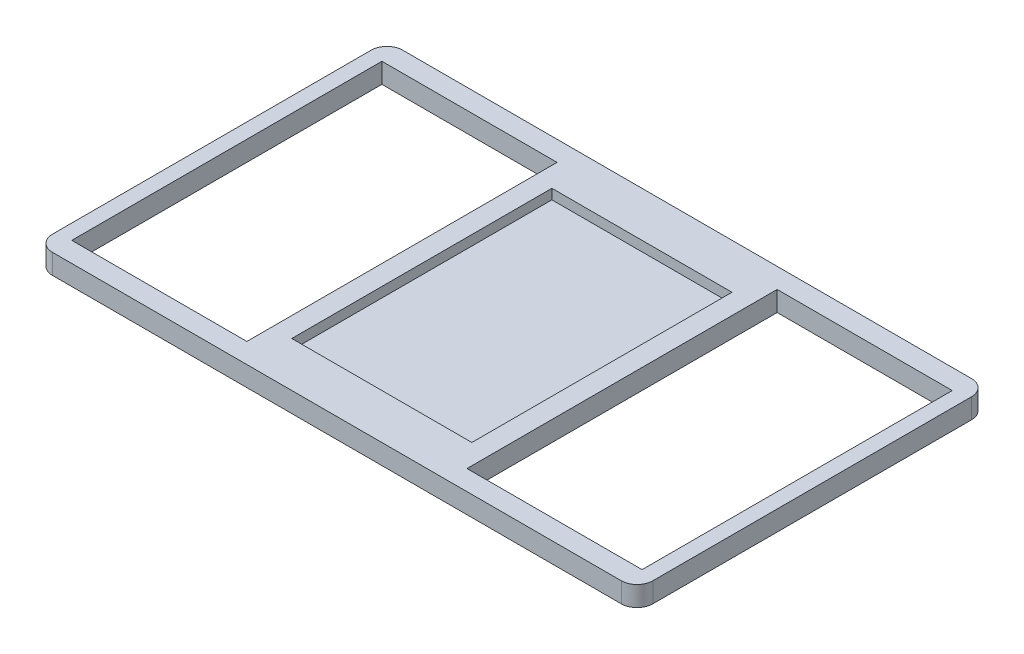
ISO-10303-21;
HEADER;
FILE_DESCRIPTION(('STEP AP214'),'2;1');
FILE_NAME('part.step','',(''),(''),'','','');
FILE_SCHEMA(('AUTOMOTIVE_DESIGN { 1 0 10303 214 1 1 1 1 }'));
ENDSEC;
DATA;
#1=APPLICATION_CONTEXT('core data for automotive mechanical design processes');
#2=APPLICATION_PROTOCOL_DEFINITION('international standard','automotive_design',2000,#1);
#3=PRODUCT_CONTEXT('',#1,'mechanical');
#4=PRODUCT('Part','Part','',(#3));
#5=PRODUCT_RELATED_PRODUCT_CATEGORY('part','',(#4));
#6=PRODUCT_DEFINITION_FORMATION('','',#4);
#7=PRODUCT_DEFINITION_CONTEXT('part definition',#1,'design');
#8=PRODUCT_DEFINITION('design','',#6,#7);
#9=PRODUCT_DEFINITION_SHAPE('','',#8);
#10=(LENGTH_UNIT() NAMED_UNIT(*) SI_UNIT(.MILLI.,.METRE.));
#11=(NAMED_UNIT(*) PLANE_ANGLE_UNIT() SI_UNIT($,.RADIAN.));
#12=(NAMED_UNIT(*) SI_UNIT($,.STERADIAN.) SOLID_ANGLE_UNIT());
#13=UNCERTAINTY_MEASURE_WITH_UNIT(LENGTH_MEASURE(1.E-05),#10,'distance_accuracy_value','');
#14=(GEOMETRIC_REPRESENTATION_CONTEXT(3) GLOBAL_UNCERTAINTY_ASSIGNED_CONTEXT((#13)) GLOBAL_UNIT_ASSIGNED_CONTEXT((#10,
#11,#12)) REPRESENTATION_CONTEXT('',''));
#15=CARTESIAN_POINT('',(0.,0.,0.));
#16=DIRECTION('',(0.,0.,1.));
#17=DIRECTION('',(1.,0.,0.));
#18=AXIS2_PLACEMENT_3D('',#15,#16,#17);
#19=CARTESIAN_POINT('',(4.79892037786772,12.7,0.));
#20=DIRECTION('',(1.,0.,0.));
#21=DIRECTION('',(0.,0.,-1.));
#22=AXIS2_PLACEMENT_3D('',#19,#20,#21);
#23=PLANE('',#22);
#24=DIRECTION('',(0.,0.,1.));
#25=VECTOR('',#24,1.);
#26=CARTESIAN_POINT('',(4.79892037786772,0.,0.));
#27=LINE('',#26,#25);
#28=CARTESIAN_POINT('',(4.79892037786772,0.,-212.25));
#29=VERTEX_POINT('',#28);
#30=CARTESIAN_POINT('',(4.79892037786772,0.,-10.));
#31=VERTEX_POINT('',#30);
#32=EDGE_CURVE('E275',#29,#31,#27,.T.);
#33=ORIENTED_EDGE('',*,*,#32,.T.);
#34=DIRECTION('',(0.,-1.,0.));
#35=VECTOR('',#34,1.);
#36=CARTESIAN_POINT('',(4.79892037786772,12.7,-10.));
#37=LINE('',#36,#35);
#38=CARTESIAN_POINT('',(4.79892037786772,12.7,-10.));
#39=VERTEX_POINT('',#38);
#40=EDGE_CURVE('E11',#31,#39,#37,.F.);
#41=ORIENTED_EDGE('',*,*,#40,.T.);
#42=DIRECTION('',(0.,0.,1.));
#43=VECTOR('',#42,1.);
#44=CARTESIAN_POINT('',(4.79892037786772,12.7,0.));
#45=LINE('',#44,#43);
#46=CARTESIAN_POINT('',(4.79892037786772,12.7,-212.25));
#47=VERTEX_POINT('',#46);
#48=EDGE_CURVE('E327',#47,#39,#45,.T.);
#49=ORIENTED_EDGE('',*,*,#48,.F.);
#50=DIRECTION('',(0.,-1.,0.));
#51=VECTOR('',#50,1.);
#52=CARTESIAN_POINT('',(4.79892037786772,12.7,-212.25));
#53=LINE('',#52,#51);
#54=EDGE_CURVE('E54',#47,#29,#53,.T.);
#55=ORIENTED_EDGE('',*,*,#54,.T.);
#56=EDGE_LOOP('',(#33,#41,#49,#55));
#57=FACE_BOUND('',#56,.T.);
#58=ADVANCED_FACE('F45',(#57),#23,.F.);
#59=CARTESIAN_POINT('',(4.79892037786772,12.7,0.));
#60=DIRECTION('',(0.,0.,-1.));
#61=DIRECTION('',(-1.,0.,0.));
#62=AXIS2_PLACEMENT_3D('',#59,#60,#61);
#63=PLANE('',#62);
#64=DIRECTION('',(1.,0.,0.));
#65=VECTOR('',#64,1.);
#66=CARTESIAN_POINT('',(4.79892037786772,0.,0.));
#67=LINE('',#66,#65);
#68=CARTESIAN_POINT('',(14.7989203778677,0.,0.));
#69=VERTEX_POINT('',#68);
#70=CARTESIAN_POINT('',(375.798920377868,0.,0.));
#71=VERTEX_POINT('',#70);
#72=EDGE_CURVE('E346',#69,#71,#67,.T.);
#73=ORIENTED_EDGE('',*,*,#72,.T.);
#74=DIRECTION('',(0.,-1.,0.));
#75=VECTOR('',#74,1.);
#76=CARTESIAN_POINT('',(375.798920377868,12.7,0.));
#77=LINE('',#76,#75);
#78=CARTESIAN_POINT('',(375.798920377868,12.7,0.));
#79=VERTEX_POINT('',#78);
#80=EDGE_CURVE('E61',#71,#79,#77,.F.);
#81=ORIENTED_EDGE('',*,*,#80,.T.);
#82=DIRECTION('',(1.,0.,0.));
#83=VECTOR('',#82,1.);
#84=CARTESIAN_POINT('',(4.79892037786772,12.7,0.));
#85=LINE('',#84,#83);
#86=CARTESIAN_POINT('',(14.7989203778677,12.7,0.));
#87=VERTEX_POINT('',#86);
#88=EDGE_CURVE('E330',#87,#79,#85,.T.);
#89=ORIENTED_EDGE('',*,*,#88,.F.);
#90=DIRECTION('',(0.,-1.,0.));
#91=VECTOR('',#90,1.);
#92=CARTESIAN_POINT('',(14.7989203778677,12.7,0.));
#93=LINE('',#92,#91);
#94=EDGE_CURVE('E392',#87,#69,#93,.T.);
#95=ORIENTED_EDGE('',*,*,#94,.T.);
#96=EDGE_LOOP('',(#73,#81,#89,#95));
#97=FACE_BOUND('',#96,.T.);
#98=ADVANCED_FACE('F413',(#97),#63,.F.);
#99=CARTESIAN_POINT('',(385.798920377868,12.7,0.));
#100=DIRECTION('',(-1.,0.,0.));
#101=DIRECTION('',(0.,0.,1.));
#102=AXIS2_PLACEMENT_3D('',#99,#100,#101);
#103=PLANE('',#102);
#104=DIRECTION('',(0.,0.,-1.));
#105=VECTOR('',#104,1.);
#106=CARTESIAN_POINT('',(385.798920377868,0.,0.));
#107=LINE('',#106,#105);
#108=CARTESIAN_POINT('',(385.798920377868,0.,-10.));
#109=VERTEX_POINT('',#108);
#110=CARTESIAN_POINT('',(385.798920377868,0.,-212.25));
#111=VERTEX_POINT('',#110);
#112=EDGE_CURVE('E349',#109,#111,#107,.T.);
#113=ORIENTED_EDGE('',*,*,#112,.T.);
#114=DIRECTION('',(0.,-1.,0.));
#115=VECTOR('',#114,1.);
#116=CARTESIAN_POINT('',(385.798920377868,12.7,-212.25));
#117=LINE('',#116,#115);
#118=CARTESIAN_POINT('',(385.798920377868,12.7,-212.25));
#119=VERTEX_POINT('',#118);
#120=EDGE_CURVE('E378',#111,#119,#117,.F.);
#121=ORIENTED_EDGE('',*,*,#120,.T.);
#122=DIRECTION('',(0.,0.,-1.));
#123=VECTOR('',#122,1.);
#124=CARTESIAN_POINT('',(385.798920377868,12.7,0.));
#125=LINE('',#124,#123);
#126=CARTESIAN_POINT('',(385.798920377868,12.7,-10.));
#127=VERTEX_POINT('',#126);
#128=EDGE_CURVE('E334',#127,#119,#125,.T.);
#129=ORIENTED_EDGE('',*,*,#128,.F.);
#130=DIRECTION('',(0.,-1.,0.));
#131=VECTOR('',#130,1.);
#132=CARTESIAN_POINT('',(385.798920377868,12.7,-10.));
#133=LINE('',#132,#131);
#134=EDGE_CURVE('E374',#127,#109,#133,.T.);
#135=ORIENTED_EDGE('',*,*,#134,.T.);
#136=EDGE_LOOP('',(#113,#121,#129,#135));
#137=FACE_BOUND('',#136,.T.);
#138=ADVANCED_FACE('F422',(#137),#103,.F.);
#139=CARTESIAN_POINT('',(4.79892037786772,12.7,-222.25));
#140=DIRECTION('',(0.,0.,1.));
#141=DIRECTION('',(1.,0.,0.));
#142=AXIS2_PLACEMENT_3D('',#139,#140,#141);
#143=PLANE('',#142);
#144=DIRECTION('',(-1.,0.,0.));
#145=VECTOR('',#144,1.);
#146=CARTESIAN_POINT('',(4.79892037786772,12.7,-222.25));
#147=LINE('',#146,#145);
#148=CARTESIAN_POINT('',(375.798920377868,12.7,-222.25));
#149=VERTEX_POINT('',#148);
#150=CARTESIAN_POINT('',(14.7989203778677,12.7,-222.25));
#151=VERTEX_POINT('',#150);
#152=EDGE_CURVE('E338',#149,#151,#147,.T.);
#153=ORIENTED_EDGE('',*,*,#152,.F.);
#154=DIRECTION('',(0.,-1.,0.));
#155=VECTOR('',#154,1.);
#156=CARTESIAN_POINT('',(375.798920377868,12.7,-222.25));
#157=LINE('',#156,#155);
#158=CARTESIAN_POINT('',(375.798920377868,0.,-222.25));
#159=VERTEX_POINT('',#158);
#160=EDGE_CURVE('E358',#149,#159,#157,.T.);
#161=ORIENTED_EDGE('',*,*,#160,.T.);
#162=DIRECTION('',(-1.,0.,0.));
#163=VECTOR('',#162,1.);
#164=CARTESIAN_POINT('',(4.79892037786772,0.,-222.25));
#165=LINE('',#164,#163);
#166=CARTESIAN_POINT('',(14.7989203778677,0.,-222.25));
#167=VERTEX_POINT('',#166);
#168=EDGE_CURVE('E331',#159,#167,#165,.T.);
#169=ORIENTED_EDGE('',*,*,#168,.T.);
#170=DIRECTION('',(0.,-1.,0.));
#171=VECTOR('',#170,1.);
#172=CARTESIAN_POINT('',(14.7989203778677,12.7,-222.25));
#173=LINE('',#172,#171);
#174=EDGE_CURVE('E342',#167,#151,#173,.F.);
#175=ORIENTED_EDGE('',*,*,#174,.T.);
#176=EDGE_LOOP('',(#153,#161,#169,#175));
#177=FACE_BOUND('',#176,.T.);
#178=ADVANCED_FACE('F430',(#177),#143,.F.);
#179=CARTESIAN_POINT('',(0.,12.7,0.));
#180=DIRECTION('',(0.,-1.,0.));
#181=DIRECTION('',(0.,0.,-1.));
#182=AXIS2_PLACEMENT_3D('',#179,#180,#181);
#183=PLANE('',#182);
#184=DIRECTION('',(1.,0.,0.));
#185=VECTOR('',#184,1.);
#186=CARTESIAN_POINT('',(138.073394244196,12.7,-28.575));
#187=LINE('',#186,#185);
#188=CARTESIAN_POINT('',(138.073394244196,12.7,-28.575));
#189=VERTEX_POINT('',#188);
#190=CARTESIAN_POINT('',(252.373394244196,12.7,-28.575));
#191=VERTEX_POINT('',#190);
#192=EDGE_CURVE('E224',#189,#191,#187,.T.);
#193=ORIENTED_EDGE('',*,*,#192,.F.);
#194=DIRECTION('',(0.,0.,1.));
#195=VECTOR('',#194,1.);
#196=CARTESIAN_POINT('',(138.073394244196,12.7,-193.675));
#197=LINE('',#196,#195);
#198=CARTESIAN_POINT('',(138.073394244196,12.7,-193.675));
#199=VERTEX_POINT('',#198);
#200=EDGE_CURVE('E191',#199,#189,#197,.T.);
#201=ORIENTED_EDGE('',*,*,#200,.F.);
#202=DIRECTION('',(-1.,0.,0.));
#203=VECTOR('',#202,1.);
#204=CARTESIAN_POINT('',(138.073394244196,12.7,-193.675));
#205=LINE('',#204,#203);
#206=CARTESIAN_POINT('',(252.373394244196,12.7,-193.675));
#207=VERTEX_POINT('',#206);
#208=EDGE_CURVE('E211',#207,#199,#205,.T.);
#209=ORIENTED_EDGE('',*,*,#208,.F.);
#210=DIRECTION('',(0.,0.,-1.));
#211=VECTOR('',#210,1.);
#212=CARTESIAN_POINT('',(252.373394244196,12.7,-193.675));
#213=LINE('',#212,#211);
#214=EDGE_CURVE('E215',#191,#207,#213,.T.);
#215=ORIENTED_EDGE('',*,*,#214,.F.);
#216=EDGE_LOOP('',(#193,#201,#209,#215));
#217=FACE_BOUND('',#216,.T.);
#218=DIRECTION('',(1.,0.,0.));
#219=VECTOR('',#218,1.);
#220=CARTESIAN_POINT('',(14.3239203778677,12.7,-12.7));
#221=LINE('',#220,#219);
#222=CARTESIAN_POINT('',(14.3239203778677,12.7,-12.7));
#223=VERTEX_POINT('',#222);
#224=CARTESIAN_POINT('',(125.448920377868,12.7,-12.7));
#225=VERTEX_POINT('',#224);
#226=EDGE_CURVE('E260',#223,#225,#221,.T.);
#227=ORIENTED_EDGE('',*,*,#226,.F.);
#228=DIRECTION('',(0.,0.,1.));
#229=VECTOR('',#228,1.);
#230=CARTESIAN_POINT('',(14.3239203778677,12.7,-209.55));
#231=LINE('',#230,#229);
#232=CARTESIAN_POINT('',(14.3239203778677,12.7,-209.55));
#233=VERTEX_POINT('',#232);
#234=EDGE_CURVE('E257',#233,#223,#231,.T.);
#235=ORIENTED_EDGE('',*,*,#234,.F.);
#236=DIRECTION('',(-1.,0.,0.));
#237=VECTOR('',#236,1.);
#238=CARTESIAN_POINT('',(14.3239203778677,12.7,-209.55));
#239=LINE('',#238,#237);
#240=CARTESIAN_POINT('',(125.448920377868,12.7,-209.55));
#241=VERTEX_POINT('',#240);
#242=EDGE_CURVE('E244',#241,#233,#239,.T.);
#243=ORIENTED_EDGE('',*,*,#242,.F.);
#244=DIRECTION('',(0.,0.,-1.));
#245=VECTOR('',#244,1.);
#246=CARTESIAN_POINT('',(125.448920377868,12.7,-209.55));
#247=LINE('',#246,#245);
#248=EDGE_CURVE('E265',#225,#241,#247,.T.);
#249=ORIENTED_EDGE('',*,*,#248,.F.);
#250=EDGE_LOOP('',(#227,#235,#243,#249));
#251=FACE_BOUND('',#250,.T.);
#252=DIRECTION('',(1.,0.,0.));
#253=VECTOR('',#252,1.);
#254=CARTESIAN_POINT('',(265.148920377868,12.7,-12.7));
#255=LINE('',#254,#253);
#256=CARTESIAN_POINT('',(265.148920377868,12.7,-12.7));
#257=VERTEX_POINT('',#256);
#258=CARTESIAN_POINT('',(376.273920377868,12.7,-12.7));
#259=VERTEX_POINT('',#258);
#260=EDGE_CURVE('E307',#257,#259,#255,.T.);
#261=ORIENTED_EDGE('',*,*,#260,.F.);
#262=DIRECTION('',(0.,0.,1.));
#263=VECTOR('',#262,1.);
#264=CARTESIAN_POINT('',(265.148920377868,12.7,-209.55));
#265=LINE('',#264,#263);
#266=CARTESIAN_POINT('',(265.148920377868,12.7,-209.55));
#267=VERTEX_POINT('',#266);
#268=EDGE_CURVE('E261',#267,#257,#265,.T.);
#269=ORIENTED_EDGE('',*,*,#268,.F.);
#270=DIRECTION('',(-1.,0.,0.));
#271=VECTOR('',#270,1.);
#272=CARTESIAN_POINT('',(265.148920377868,12.7,-209.55));
#273=LINE('',#272,#271);
#274=CARTESIAN_POINT('',(376.273920377868,12.7,-209.55));
#275=VERTEX_POINT('',#274);
#276=EDGE_CURVE('E298',#275,#267,#273,.T.);
#277=ORIENTED_EDGE('',*,*,#276,.F.);
#278=DIRECTION('',(0.,0.,-1.));
#279=VECTOR('',#278,1.);
#280=CARTESIAN_POINT('',(376.273920377868,12.7,-209.55));
#281=LINE('',#280,#279);
#282=EDGE_CURVE('E302',#259,#275,#281,.T.);
#283=ORIENTED_EDGE('',*,*,#282,.F.);
#284=EDGE_LOOP('',(#261,#269,#277,#283));
#285=FACE_BOUND('',#284,.T.);
#286=ORIENTED_EDGE('',*,*,#128,.T.);
#287=CARTESIAN_POINT('',(375.798920377868,12.7,-212.25));
#288=DIRECTION('',(0.,-1.,0.));
#289=DIRECTION('',(0.,0.,-1.));
#290=AXIS2_PLACEMENT_3D('',#287,#288,#289);
#291=CIRCLE('',#290,10.);
#292=EDGE_CURVE('E389',#119,#149,#291,.F.);
#293=ORIENTED_EDGE('',*,*,#292,.T.);
#294=ORIENTED_EDGE('',*,*,#152,.T.);
#295=CARTESIAN_POINT('',(14.7989203778677,12.7,-212.25));
#296=DIRECTION('',(0.,-1.,0.));
#297=DIRECTION('',(0.,0.,-1.));
#298=AXIS2_PLACEMENT_3D('',#295,#296,#297);
#299=CIRCLE('',#298,10.);
#300=EDGE_CURVE('E381',#151,#47,#299,.F.);
#301=ORIENTED_EDGE('',*,*,#300,.T.);
#302=ORIENTED_EDGE('',*,*,#48,.T.);
#303=CARTESIAN_POINT('',(14.7989203778677,12.7,-10.));
#304=DIRECTION('',(0.,-1.,0.));
#305=DIRECTION('',(0.,0.,-1.));
#306=AXIS2_PLACEMENT_3D('',#303,#304,#305);
#307=CIRCLE('',#306,10.);
#308=EDGE_CURVE('E68',#39,#87,#307,.F.);
#309=ORIENTED_EDGE('',*,*,#308,.T.);
#310=ORIENTED_EDGE('',*,*,#88,.T.);
#311=CARTESIAN_POINT('',(375.798920377868,12.7,-10.));
#312=DIRECTION('',(0.,-1.,0.));
#313=DIRECTION('',(0.,0.,-1.));
#314=AXIS2_PLACEMENT_3D('',#311,#312,#313);
#315=CIRCLE('',#314,10.);
#316=EDGE_CURVE('E386',#79,#127,#315,.F.);
#317=ORIENTED_EDGE('',*,*,#316,.T.);
#318=EDGE_LOOP('',(#286,#293,#294,#301,#302,#309,#310,#317));
#319=FACE_BOUND('',#318,.T.);
#320=ADVANCED_FACE('F415',(#217,#251,#285,#319),#183,.F.);
#321=CARTESIAN_POINT('',(0.,0.,0.));
#322=DIRECTION('',(0.,-1.,0.));
#323=DIRECTION('',(0.,0.,-1.));
#324=AXIS2_PLACEMENT_3D('',#321,#322,#323);
#325=PLANE('',#324);
#326=DIRECTION('',(0.,0.,1.));
#327=VECTOR('',#326,1.);
#328=CARTESIAN_POINT('',(14.3239203778677,0.,-209.55));
#329=LINE('',#328,#327);
#330=CARTESIAN_POINT('',(14.3239203778677,0.,-209.55));
#331=VERTEX_POINT('',#330);
#332=CARTESIAN_POINT('',(14.3239203778677,0.,-12.7));
#333=VERTEX_POINT('',#332);
#334=EDGE_CURVE('E239',#331,#333,#329,.T.);
#335=ORIENTED_EDGE('',*,*,#334,.T.);
#336=DIRECTION('',(1.,0.,0.));
#337=VECTOR('',#336,1.);
#338=CARTESIAN_POINT('',(14.3239203778677,0.,-12.7));
#339=LINE('',#338,#337);
#340=CARTESIAN_POINT('',(125.448920377868,0.,-12.7));
#341=VERTEX_POINT('',#340);
#342=EDGE_CURVE('E243',#333,#341,#339,.T.);
#343=ORIENTED_EDGE('',*,*,#342,.T.);
#344=DIRECTION('',(0.,0.,-1.));
#345=VECTOR('',#344,1.);
#346=CARTESIAN_POINT('',(125.448920377868,0.,-209.55));
#347=LINE('',#346,#345);
#348=CARTESIAN_POINT('',(125.448920377868,0.,-209.55));
#349=VERTEX_POINT('',#348);
#350=EDGE_CURVE('E248',#341,#349,#347,.T.);
#351=ORIENTED_EDGE('',*,*,#350,.T.);
#352=DIRECTION('',(-1.,0.,0.));
#353=VECTOR('',#352,1.);
#354=CARTESIAN_POINT('',(14.3239203778677,0.,-209.55));
#355=LINE('',#354,#353);
#356=EDGE_CURVE('E252',#349,#331,#355,.T.);
#357=ORIENTED_EDGE('',*,*,#356,.T.);
#358=EDGE_LOOP('',(#335,#343,#351,#357));
#359=FACE_BOUND('',#358,.T.);
#360=DIRECTION('',(0.,0.,1.));
#361=VECTOR('',#360,1.);
#362=CARTESIAN_POINT('',(265.148920377868,0.,-209.55));
#363=LINE('',#362,#361);
#364=CARTESIAN_POINT('',(265.148920377868,0.,-209.55));
#365=VERTEX_POINT('',#364);
#366=CARTESIAN_POINT('',(265.148920377868,0.,-12.7));
#367=VERTEX_POINT('',#366);
#368=EDGE_CURVE('E303',#365,#367,#363,.T.);
#369=ORIENTED_EDGE('',*,*,#368,.T.);
#370=DIRECTION('',(1.,0.,0.));
#371=VECTOR('',#370,1.);
#372=CARTESIAN_POINT('',(265.148920377868,0.,-12.7));
#373=LINE('',#372,#371);
#374=CARTESIAN_POINT('',(376.273920377868,0.,-12.7));
#375=VERTEX_POINT('',#374);
#376=EDGE_CURVE('E320',#367,#375,#373,.T.);
#377=ORIENTED_EDGE('',*,*,#376,.T.);
#378=DIRECTION('',(0.,0.,-1.));
#379=VECTOR('',#378,1.);
#380=CARTESIAN_POINT('',(376.273920377868,0.,-209.55));
#381=LINE('',#380,#379);
#382=CARTESIAN_POINT('',(376.273920377868,0.,-209.55));
#383=VERTEX_POINT('',#382);
#384=EDGE_CURVE('E316',#375,#383,#381,.T.);
#385=ORIENTED_EDGE('',*,*,#384,.T.);
#386=DIRECTION('',(-1.,0.,0.));
#387=VECTOR('',#386,1.);
#388=CARTESIAN_POINT('',(265.148920377868,0.,-209.55));
#389=LINE('',#388,#387);
#390=EDGE_CURVE('E289',#383,#365,#389,.T.);
#391=ORIENTED_EDGE('',*,*,#390,.T.);
#392=EDGE_LOOP('',(#369,#377,#385,#391));
#393=FACE_BOUND('',#392,.T.);
#394=ORIENTED_EDGE('',*,*,#168,.F.);
#395=CARTESIAN_POINT('',(375.798920377868,0.,-212.25));
#396=DIRECTION('',(0.,-1.,0.));
#397=DIRECTION('',(0.,0.,-1.));
#398=AXIS2_PLACEMENT_3D('',#395,#396,#397);
#399=CIRCLE('',#398,10.);
#400=EDGE_CURVE('E371',#159,#111,#399,.T.);
#401=ORIENTED_EDGE('',*,*,#400,.T.);
#402=ORIENTED_EDGE('',*,*,#112,.F.);
#403=CARTESIAN_POINT('',(375.798920377868,0.,-10.));
#404=DIRECTION('',(0.,-1.,0.));
#405=DIRECTION('',(0.,0.,-1.));
#406=AXIS2_PLACEMENT_3D('',#403,#404,#405);
#407=CIRCLE('',#406,10.);
#408=EDGE_CURVE('E368',#109,#71,#407,.T.);
#409=ORIENTED_EDGE('',*,*,#408,.T.);
#410=ORIENTED_EDGE('',*,*,#72,.F.);
#411=CARTESIAN_POINT('',(14.7989203778677,0.,-10.));
#412=DIRECTION('',(0.,-1.,0.));
#413=DIRECTION('',(0.,0.,-1.));
#414=AXIS2_PLACEMENT_3D('',#411,#412,#413);
#415=CIRCLE('',#414,10.);
#416=EDGE_CURVE('E365',#69,#31,#415,.T.);
#417=ORIENTED_EDGE('',*,*,#416,.T.);
#418=ORIENTED_EDGE('',*,*,#32,.F.);
#419=CARTESIAN_POINT('',(14.7989203778677,0.,-212.25));
#420=DIRECTION('',(0.,-1.,0.));
#421=DIRECTION('',(0.,0.,-1.));
#422=AXIS2_PLACEMENT_3D('',#419,#420,#421);
#423=CIRCLE('',#422,10.);
#424=EDGE_CURVE('E362',#29,#167,#423,.T.);
#425=ORIENTED_EDGE('',*,*,#424,.T.);
#426=EDGE_LOOP('',(#394,#401,#402,#409,#410,#417,#418,#425));
#427=FACE_BOUND('',#426,.T.);
#428=ADVANCED_FACE('F408',(#359,#393,#427),#325,.T.);
#429=CARTESIAN_POINT('',(265.148920377868,0.,-209.55));
#430=DIRECTION('',(-1.,0.,0.));
#431=DIRECTION('',(0.,0.,1.));
#432=AXIS2_PLACEMENT_3D('',#429,#430,#431);
#433=PLANE('',#432);
#434=ORIENTED_EDGE('',*,*,#268,.T.);
#435=DIRECTION('',(0.,1.,0.));
#436=VECTOR('',#435,1.);
#437=CARTESIAN_POINT('',(265.148920377868,0.,-12.7));
#438=LINE('',#437,#436);
#439=EDGE_CURVE('E285',#367,#257,#438,.T.);
#440=ORIENTED_EDGE('',*,*,#439,.F.);
#441=ORIENTED_EDGE('',*,*,#368,.F.);
#442=DIRECTION('',(0.,1.,0.));
#443=VECTOR('',#442,1.);
#444=CARTESIAN_POINT('',(265.148920377868,0.,-209.55));
#445=LINE('',#444,#443);
#446=EDGE_CURVE('E233',#365,#267,#445,.T.);
#447=ORIENTED_EDGE('',*,*,#446,.T.);
#448=EDGE_LOOP('',(#434,#440,#441,#447));
#449=FACE_BOUND('',#448,.T.);
#450=ADVANCED_FACE('F569',(#449),#433,.F.);
#451=CARTESIAN_POINT('',(265.148920377868,0.,-209.55));
#452=DIRECTION('',(0.,0.,-1.));
#453=DIRECTION('',(-1.,0.,0.));
#454=AXIS2_PLACEMENT_3D('',#451,#452,#453);
#455=PLANE('',#454);
#456=ORIENTED_EDGE('',*,*,#276,.T.);
#457=ORIENTED_EDGE('',*,*,#446,.F.);
#458=ORIENTED_EDGE('',*,*,#390,.F.);
#459=DIRECTION('',(0.,1.,0.));
#460=VECTOR('',#459,1.);
#461=CARTESIAN_POINT('',(376.273920377868,0.,-209.55));
#462=LINE('',#461,#460);
#463=EDGE_CURVE('E293',#383,#275,#462,.T.);
#464=ORIENTED_EDGE('',*,*,#463,.T.);
#465=EDGE_LOOP('',(#456,#457,#458,#464));
#466=FACE_BOUND('',#465,.T.);
#467=ADVANCED_FACE('F560',(#466),#455,.F.);
#468=CARTESIAN_POINT('',(376.273920377868,0.,-209.55));
#469=DIRECTION('',(1.,0.,0.));
#470=DIRECTION('',(0.,0.,-1.));
#471=AXIS2_PLACEMENT_3D('',#468,#469,#470);
#472=PLANE('',#471);
#473=ORIENTED_EDGE('',*,*,#282,.T.);
#474=ORIENTED_EDGE('',*,*,#463,.F.);
#475=ORIENTED_EDGE('',*,*,#384,.F.);
#476=DIRECTION('',(0.,1.,0.));
#477=VECTOR('',#476,1.);
#478=CARTESIAN_POINT('',(376.273920377868,0.,-12.7));
#479=LINE('',#478,#477);
#480=EDGE_CURVE('E290',#375,#259,#479,.T.);
#481=ORIENTED_EDGE('',*,*,#480,.T.);
#482=EDGE_LOOP('',(#473,#474,#475,#481));
#483=FACE_BOUND('',#482,.T.);
#484=ADVANCED_FACE('F551',(#483),#472,.F.);
#485=CARTESIAN_POINT('',(265.148920377868,0.,-12.7));
#486=DIRECTION('',(0.,0.,1.));
#487=DIRECTION('',(1.,0.,0.));
#488=AXIS2_PLACEMENT_3D('',#485,#486,#487);
#489=PLANE('',#488);
#490=ORIENTED_EDGE('',*,*,#260,.T.);
#491=ORIENTED_EDGE('',*,*,#480,.F.);
#492=ORIENTED_EDGE('',*,*,#376,.F.);
#493=ORIENTED_EDGE('',*,*,#439,.T.);
#494=EDGE_LOOP('',(#490,#491,#492,#493));
#495=FACE_BOUND('',#494,.T.);
#496=ADVANCED_FACE('F542',(#495),#489,.F.);
#497=CARTESIAN_POINT('',(14.3239203778677,0.,-209.55));
#498=DIRECTION('',(-1.,0.,0.));
#499=DIRECTION('',(0.,0.,1.));
#500=AXIS2_PLACEMENT_3D('',#497,#498,#499);
#501=PLANE('',#500);
#502=ORIENTED_EDGE('',*,*,#234,.T.);
#503=DIRECTION('',(0.,1.,0.));
#504=VECTOR('',#503,1.);
#505=CARTESIAN_POINT('',(14.3239203778677,0.,-12.7));
#506=LINE('',#505,#504);
#507=EDGE_CURVE('E256',#333,#223,#506,.T.);
#508=ORIENTED_EDGE('',*,*,#507,.F.);
#509=ORIENTED_EDGE('',*,*,#334,.F.);
#510=DIRECTION('',(0.,1.,0.));
#511=VECTOR('',#510,1.);
#512=CARTESIAN_POINT('',(14.3239203778677,0.,-209.55));
#513=LINE('',#512,#511);
#514=EDGE_CURVE('E272',#331,#233,#513,.T.);
#515=ORIENTED_EDGE('',*,*,#514,.T.);
#516=EDGE_LOOP('',(#502,#508,#509,#515));
#517=FACE_BOUND('',#516,.T.);
#518=ADVANCED_FACE('F533',(#517),#501,.F.);
#519=CARTESIAN_POINT('',(14.3239203778677,0.,-209.55));
#520=DIRECTION('',(0.,0.,-1.));
#521=DIRECTION('',(-1.,0.,0.));
#522=AXIS2_PLACEMENT_3D('',#519,#520,#521);
#523=PLANE('',#522);
#524=ORIENTED_EDGE('',*,*,#242,.T.);
#525=ORIENTED_EDGE('',*,*,#514,.F.);
#526=ORIENTED_EDGE('',*,*,#356,.F.);
#527=DIRECTION('',(0.,1.,0.));
#528=VECTOR('',#527,1.);
#529=CARTESIAN_POINT('',(125.448920377868,0.,-209.55));
#530=LINE('',#529,#528);
#531=EDGE_CURVE('E276',#349,#241,#530,.T.);
#532=ORIENTED_EDGE('',*,*,#531,.T.);
#533=EDGE_LOOP('',(#524,#525,#526,#532));
#534=FACE_BOUND('',#533,.T.);
#535=ADVANCED_FACE('F524',(#534),#523,.F.);
#536=CARTESIAN_POINT('',(125.448920377868,0.,-209.55));
#537=DIRECTION('',(1.,0.,0.));
#538=DIRECTION('',(0.,0.,-1.));
#539=AXIS2_PLACEMENT_3D('',#536,#537,#538);
#540=PLANE('',#539);
#541=ORIENTED_EDGE('',*,*,#248,.T.);
#542=ORIENTED_EDGE('',*,*,#531,.F.);
#543=ORIENTED_EDGE('',*,*,#350,.F.);
#544=DIRECTION('',(0.,1.,0.));
#545=VECTOR('',#544,1.);
#546=CARTESIAN_POINT('',(125.448920377868,0.,-12.7));
#547=LINE('',#546,#545);
#548=EDGE_CURVE('E279',#341,#225,#547,.T.);
#549=ORIENTED_EDGE('',*,*,#548,.T.);
#550=EDGE_LOOP('',(#541,#542,#543,#549));
#551=FACE_BOUND('',#550,.T.);
#552=ADVANCED_FACE('F515',(#551),#540,.F.);
#553=CARTESIAN_POINT('',(14.3239203778677,0.,-12.7));
#554=DIRECTION('',(0.,0.,1.));
#555=DIRECTION('',(1.,0.,0.));
#556=AXIS2_PLACEMENT_3D('',#553,#554,#555);
#557=PLANE('',#556);
#558=ORIENTED_EDGE('',*,*,#226,.T.);
#559=ORIENTED_EDGE('',*,*,#548,.F.);
#560=ORIENTED_EDGE('',*,*,#342,.F.);
#561=ORIENTED_EDGE('',*,*,#507,.T.);
#562=EDGE_LOOP('',(#558,#559,#560,#561));
#563=FACE_BOUND('',#562,.T.);
#564=ADVANCED_FACE('F507',(#563),#557,.F.);
#565=CARTESIAN_POINT('',(138.073394244196,6.35,-193.675));
#566=DIRECTION('',(-1.,0.,0.));
#567=DIRECTION('',(0.,0.,1.));
#568=AXIS2_PLACEMENT_3D('',#565,#566,#567);
#569=PLANE('',#568);
#570=ORIENTED_EDGE('',*,*,#200,.T.);
#571=DIRECTION('',(0.,1.,0.));
#572=VECTOR('',#571,1.);
#573=CARTESIAN_POINT('',(138.073394244196,6.35,-28.575));
#574=LINE('',#573,#572);
#575=CARTESIAN_POINT('',(138.073394244196,6.35,-28.575));
#576=VERTEX_POINT('',#575);
#577=EDGE_CURVE('E184',#576,#189,#574,.T.);
#578=ORIENTED_EDGE('',*,*,#577,.F.);
#579=DIRECTION('',(0.,0.,1.));
#580=VECTOR('',#579,1.);
#581=CARTESIAN_POINT('',(138.073394244196,6.35,-193.675));
#582=LINE('',#581,#580);
#583=CARTESIAN_POINT('',(138.073394244196,6.35,-193.675));
#584=VERTEX_POINT('',#583);
#585=EDGE_CURVE('E188',#584,#576,#582,.T.);
#586=ORIENTED_EDGE('',*,*,#585,.F.);
#587=DIRECTION('',(0.,1.,0.));
#588=VECTOR('',#587,1.);
#589=CARTESIAN_POINT('',(138.073394244196,6.35,-193.675));
#590=LINE('',#589,#588);
#591=EDGE_CURVE('E230',#584,#199,#590,.T.);
#592=ORIENTED_EDGE('',*,*,#591,.T.);
#593=EDGE_LOOP('',(#570,#578,#586,#592));
#594=FACE_BOUND('',#593,.T.);
#595=ADVANCED_FACE('F186',(#594),#569,.F.);
#596=CARTESIAN_POINT('',(138.073394244196,6.35,-193.675));
#597=DIRECTION('',(0.,0.,-1.));
#598=DIRECTION('',(-1.,0.,0.));
#599=AXIS2_PLACEMENT_3D('',#596,#597,#598);
#600=PLANE('',#599);
#601=ORIENTED_EDGE('',*,*,#208,.T.);
#602=ORIENTED_EDGE('',*,*,#591,.F.);
#603=DIRECTION('',(-1.,0.,0.));
#604=VECTOR('',#603,1.);
#605=CARTESIAN_POINT('',(138.073394244196,6.35,-193.675));
#606=LINE('',#605,#604);
#607=CARTESIAN_POINT('',(252.373394244196,6.35,-193.675));
#608=VERTEX_POINT('',#607);
#609=EDGE_CURVE('E197',#608,#584,#606,.T.);
#610=ORIENTED_EDGE('',*,*,#609,.F.);
#611=DIRECTION('',(0.,1.,0.));
#612=VECTOR('',#611,1.);
#613=CARTESIAN_POINT('',(252.373394244196,6.35,-193.675));
#614=LINE('',#613,#612);
#615=EDGE_CURVE('E234',#608,#207,#614,.T.);
#616=ORIENTED_EDGE('',*,*,#615,.T.);
#617=EDGE_LOOP('',(#601,#602,#610,#616));
#618=FACE_BOUND('',#617,.T.);
#619=ADVANCED_FACE('F490',(#618),#600,.F.);
#620=CARTESIAN_POINT('',(252.373394244196,6.35,-193.675));
#621=DIRECTION('',(1.,0.,0.));
#622=DIRECTION('',(0.,0.,-1.));
#623=AXIS2_PLACEMENT_3D('',#620,#621,#622);
#624=PLANE('',#623);
#625=ORIENTED_EDGE('',*,*,#214,.T.);
#626=ORIENTED_EDGE('',*,*,#615,.F.);
#627=DIRECTION('',(0.,0.,-1.));
#628=VECTOR('',#627,1.);
#629=CARTESIAN_POINT('',(252.373394244196,6.35,-193.675));
#630=LINE('',#629,#628);
#631=CARTESIAN_POINT('',(252.373394244196,6.35,-28.575));
#632=VERTEX_POINT('',#631);
#633=EDGE_CURVE('E206',#632,#608,#630,.T.);
#634=ORIENTED_EDGE('',*,*,#633,.F.);
#635=DIRECTION('',(0.,1.,0.));
#636=VECTOR('',#635,1.);
#637=CARTESIAN_POINT('',(252.373394244196,6.35,-28.575));
#638=LINE('',#637,#636);
#639=EDGE_CURVE('E196',#632,#191,#638,.T.);
#640=ORIENTED_EDGE('',*,*,#639,.T.);
#641=EDGE_LOOP('',(#625,#626,#634,#640));
#642=FACE_BOUND('',#641,.T.);
#643=ADVANCED_FACE('F482',(#642),#624,.F.);
#644=CARTESIAN_POINT('',(138.073394244196,6.35,-28.575));
#645=DIRECTION('',(0.,0.,1.));
#646=DIRECTION('',(1.,0.,0.));
#647=AXIS2_PLACEMENT_3D('',#644,#645,#646);
#648=PLANE('',#647);
#649=ORIENTED_EDGE('',*,*,#192,.T.);
#650=ORIENTED_EDGE('',*,*,#639,.F.);
#651=DIRECTION('',(1.,0.,0.));
#652=VECTOR('',#651,1.);
#653=CARTESIAN_POINT('',(138.073394244196,6.35,-28.575));
#654=LINE('',#653,#652);
#655=EDGE_CURVE('E200',#576,#632,#654,.T.);
#656=ORIENTED_EDGE('',*,*,#655,.F.);
#657=ORIENTED_EDGE('',*,*,#577,.T.);
#658=EDGE_LOOP('',(#649,#650,#656,#657));
#659=FACE_BOUND('',#658,.T.);
#660=ADVANCED_FACE('F201',(#659),#648,.F.);
#661=CARTESIAN_POINT('',(0.,6.35,0.));
#662=DIRECTION('',(0.,1.,0.));
#663=DIRECTION('',(0.,0.,1.));
#664=AXIS2_PLACEMENT_3D('',#661,#662,#663);
#665=PLANE('',#664);
#666=ORIENTED_EDGE('',*,*,#585,.T.);
#667=ORIENTED_EDGE('',*,*,#655,.T.);
#668=ORIENTED_EDGE('',*,*,#633,.T.);
#669=ORIENTED_EDGE('',*,*,#609,.T.);
#670=EDGE_LOOP('',(#666,#667,#668,#669));
#671=FACE_BOUND('',#670,.T.);
#672=ADVANCED_FACE('F208',(#671),#665,.T.);
#673=CARTESIAN_POINT('',(375.798920377868,12.7,-212.25));
#674=DIRECTION('',(0.,-1.,0.));
#675=DIRECTION('',(0.,0.,-1.));
#676=AXIS2_PLACEMENT_3D('',#673,#674,#675);
#677=CYLINDRICAL_SURFACE('',#676,10.);
#678=ORIENTED_EDGE('',*,*,#292,.F.);
#679=ORIENTED_EDGE('',*,*,#120,.F.);
#680=ORIENTED_EDGE('',*,*,#400,.F.);
#681=ORIENTED_EDGE('',*,*,#160,.F.);
#682=EDGE_LOOP('',(#678,#679,#680,#681));
#683=FACE_BOUND('',#682,.T.);
#684=ADVANCED_FACE('F427',(#683),#677,.T.);
#685=CARTESIAN_POINT('',(375.798920377868,12.7,-10.));
#686=DIRECTION('',(0.,-1.,0.));
#687=DIRECTION('',(0.,0.,-1.));
#688=AXIS2_PLACEMENT_3D('',#685,#686,#687);
#689=CYLINDRICAL_SURFACE('',#688,10.);
#690=ORIENTED_EDGE('',*,*,#316,.F.);
#691=ORIENTED_EDGE('',*,*,#80,.F.);
#692=ORIENTED_EDGE('',*,*,#408,.F.);
#693=ORIENTED_EDGE('',*,*,#134,.F.);
#694=EDGE_LOOP('',(#690,#691,#692,#693));
#695=FACE_BOUND('',#694,.T.);
#696=ADVANCED_FACE('F419',(#695),#689,.T.);
#697=CARTESIAN_POINT('',(14.7989203778677,12.7,-10.));
#698=DIRECTION('',(0.,-1.,0.));
#699=DIRECTION('',(0.,0.,-1.));
#700=AXIS2_PLACEMENT_3D('',#697,#698,#699);
#701=CYLINDRICAL_SURFACE('',#700,10.);
#702=ORIENTED_EDGE('',*,*,#308,.F.);
#703=ORIENTED_EDGE('',*,*,#40,.F.);
#704=ORIENTED_EDGE('',*,*,#416,.F.);
#705=ORIENTED_EDGE('',*,*,#94,.F.);
#706=EDGE_LOOP('',(#702,#703,#704,#705));
#707=FACE_BOUND('',#706,.T.);
#708=ADVANCED_FACE('F412',(#707),#701,.T.);
#709=CARTESIAN_POINT('',(14.7989203778677,12.7,-212.25));
#710=DIRECTION('',(0.,-1.,0.));
#711=DIRECTION('',(0.,0.,-1.));
#712=AXIS2_PLACEMENT_3D('',#709,#710,#711);
#713=CYLINDRICAL_SURFACE('',#712,10.);
#714=ORIENTED_EDGE('',*,*,#300,.F.);
#715=ORIENTED_EDGE('',*,*,#174,.F.);
#716=ORIENTED_EDGE('',*,*,#424,.F.);
#717=ORIENTED_EDGE('',*,*,#54,.F.);
#718=EDGE_LOOP('',(#714,#715,#716,#717));
#719=FACE_BOUND('',#718,.T.);
#720=ADVANCED_FACE('F47',(#719),#713,.T.);
#721=CLOSED_SHELL('',(#58,#98,#138,#178,#320,#428,#450,#467,#484,#496,#518,#535,#552,#564,#595,
#619,#643,#660,#672,#684,#696,#708,#720));
#722=MANIFOLD_SOLID_BREP('B2',#721);
#723=ADVANCED_BREP_SHAPE_REPRESENTATION('',(#18,#722),#14);
#724=SHAPE_DEFINITION_REPRESENTATION(#9,#723);
ENDSEC;
END-ISO-10303-21;
